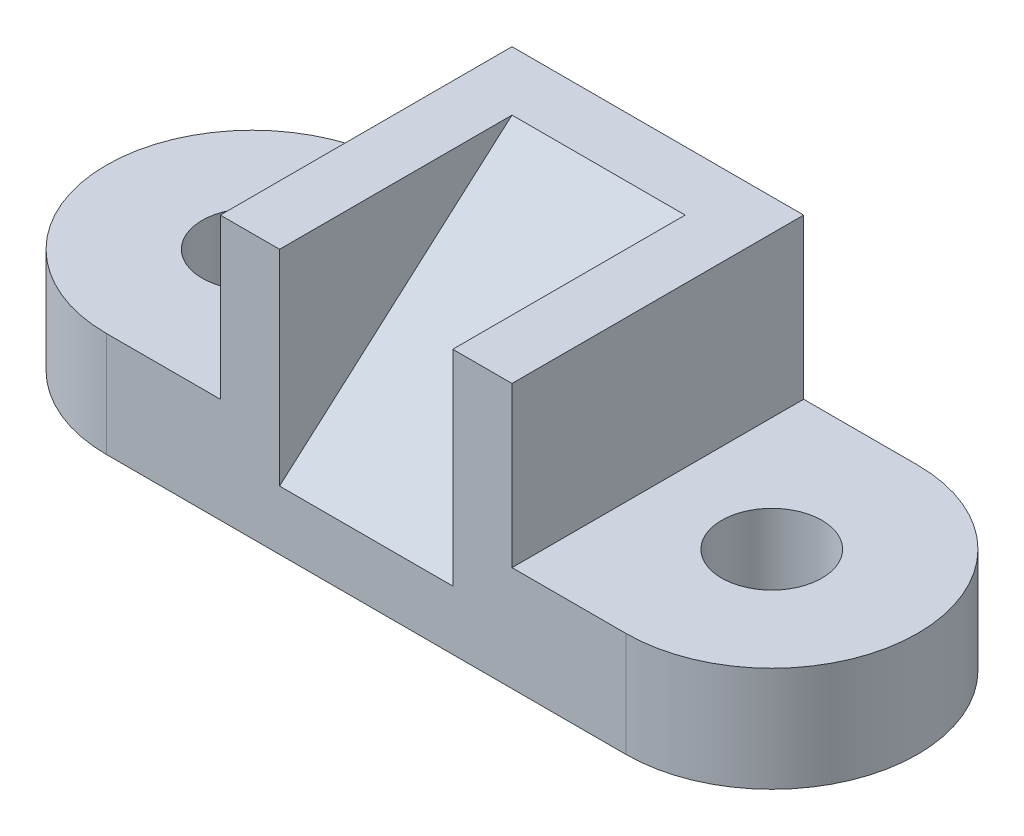
ISO-10303-21;
HEADER;
FILE_DESCRIPTION(('STEP AP214'),'2;1');
FILE_NAME('part.step','',(''),(''),'','','');
FILE_SCHEMA(('AUTOMOTIVE_DESIGN { 1 0 10303 214 1 1 1 1 }'));
ENDSEC;
DATA;
#1=APPLICATION_CONTEXT('core data for automotive mechanical design processes');
#2=APPLICATION_PROTOCOL_DEFINITION('international standard','automotive_design',2000,#1);
#3=PRODUCT_CONTEXT('',#1,'mechanical');
#4=PRODUCT('Part','Part','',(#3));
#5=PRODUCT_RELATED_PRODUCT_CATEGORY('part','',(#4));
#6=PRODUCT_DEFINITION_FORMATION('','',#4);
#7=PRODUCT_DEFINITION_CONTEXT('part definition',#1,'design');
#8=PRODUCT_DEFINITION('design','',#6,#7);
#9=PRODUCT_DEFINITION_SHAPE('','',#8);
#10=(LENGTH_UNIT() NAMED_UNIT(*) SI_UNIT(.MILLI.,.METRE.));
#11=(NAMED_UNIT(*) PLANE_ANGLE_UNIT() SI_UNIT($,.RADIAN.));
#12=(NAMED_UNIT(*) SI_UNIT($,.STERADIAN.) SOLID_ANGLE_UNIT());
#13=UNCERTAINTY_MEASURE_WITH_UNIT(LENGTH_MEASURE(1.E-05),#10,'distance_accuracy_value','');
#14=(GEOMETRIC_REPRESENTATION_CONTEXT(3) GLOBAL_UNCERTAINTY_ASSIGNED_CONTEXT((#13)) GLOBAL_UNIT_ASSIGNED_CONTEXT((#10,
#11,#12)) REPRESENTATION_CONTEXT('',''));
#15=CARTESIAN_POINT('',(0.,0.,0.));
#16=DIRECTION('',(0.,0.,1.));
#17=DIRECTION('',(1.,0.,0.));
#18=AXIS2_PLACEMENT_3D('',#15,#16,#17);
#19=CARTESIAN_POINT('',(32.,58.,0.));
#20=DIRECTION('',(1.,0.,0.));
#21=DIRECTION('',(0.,0.,-1.));
#22=AXIS2_PLACEMENT_3D('',#19,#20,#21);
#23=PLANE('',#22);
#24=DIRECTION('',(0.,-1.,0.));
#25=VECTOR('',#24,1.);
#26=CARTESIAN_POINT('',(32.,58.,32.));
#27=LINE('',#26,#25);
#28=CARTESIAN_POINT('',(32.,58.,32.));
#29=VERTEX_POINT('',#28);
#30=CARTESIAN_POINT('',(32.,23.,32.));
#31=VERTEX_POINT('',#30);
#32=EDGE_CURVE('E128',#29,#31,#27,.T.);
#33=ORIENTED_EDGE('',*,*,#32,.T.);
#34=DIRECTION('',(0.,0.,1.));
#35=VECTOR('',#34,1.);
#36=CARTESIAN_POINT('',(32.,23.,32.));
#37=LINE('',#36,#35);
#38=CARTESIAN_POINT('',(32.,23.,-32.));
#39=VERTEX_POINT('',#38);
#40=EDGE_CURVE('E134',#39,#31,#37,.T.);
#41=ORIENTED_EDGE('',*,*,#40,.F.);
#42=DIRECTION('',(0.,-1.,0.));
#43=VECTOR('',#42,1.);
#44=CARTESIAN_POINT('',(32.,58.,-32.));
#45=LINE('',#44,#43);
#46=CARTESIAN_POINT('',(32.,58.,-32.));
#47=VERTEX_POINT('',#46);
#48=EDGE_CURVE('E164',#47,#39,#45,.T.);
#49=ORIENTED_EDGE('',*,*,#48,.F.);
#50=DIRECTION('',(0.,0.,1.));
#51=VECTOR('',#50,1.);
#52=CARTESIAN_POINT('',(32.,58.,0.));
#53=LINE('',#52,#51);
#54=EDGE_CURVE('E146',#47,#29,#53,.T.);
#55=ORIENTED_EDGE('',*,*,#54,.T.);
#56=EDGE_LOOP('',(#33,#41,#49,#55));
#57=FACE_BOUND('',#56,.T.);
#58=ADVANCED_FACE('F39',(#57),#23,.T.);
#59=CARTESIAN_POINT('',(-32.,58.,0.));
#60=DIRECTION('',(-1.,0.,0.));
#61=DIRECTION('',(0.,0.,1.));
#62=AXIS2_PLACEMENT_3D('',#59,#60,#61);
#63=PLANE('',#62);
#64=DIRECTION('',(0.,-1.,0.));
#65=VECTOR('',#64,1.);
#66=CARTESIAN_POINT('',(-32.,58.,-32.));
#67=LINE('',#66,#65);
#68=CARTESIAN_POINT('',(-32.,58.,-32.));
#69=VERTEX_POINT('',#68);
#70=CARTESIAN_POINT('',(-32.,23.,-32.));
#71=VERTEX_POINT('',#70);
#72=EDGE_CURVE('E161',#69,#71,#67,.T.);
#73=ORIENTED_EDGE('',*,*,#72,.T.);
#74=DIRECTION('',(0.,0.,-1.));
#75=VECTOR('',#74,1.);
#76=CARTESIAN_POINT('',(-32.,23.,32.));
#77=LINE('',#76,#75);
#78=CARTESIAN_POINT('',(-32.,23.,32.));
#79=VERTEX_POINT('',#78);
#80=EDGE_CURVE('E213',#79,#71,#77,.T.);
#81=ORIENTED_EDGE('',*,*,#80,.F.);
#82=DIRECTION('',(0.,-1.,0.));
#83=VECTOR('',#82,1.);
#84=CARTESIAN_POINT('',(-32.,58.,32.));
#85=LINE('',#84,#83);
#86=CARTESIAN_POINT('',(-32.,58.,32.));
#87=VERTEX_POINT('',#86);
#88=EDGE_CURVE('E158',#87,#79,#85,.T.);
#89=ORIENTED_EDGE('',*,*,#88,.F.);
#90=DIRECTION('',(0.,0.,-1.));
#91=VECTOR('',#90,1.);
#92=CARTESIAN_POINT('',(-32.,58.,0.));
#93=LINE('',#92,#91);
#94=EDGE_CURVE('E225',#87,#69,#93,.T.);
#95=ORIENTED_EDGE('',*,*,#94,.T.);
#96=EDGE_LOOP('',(#73,#81,#89,#95));
#97=FACE_BOUND('',#96,.T.);
#98=ADVANCED_FACE('F249',(#97),#63,.T.);
#99=CARTESIAN_POINT('',(-57.,0.,0.));
#100=DIRECTION('',(0.,1.,0.));
#101=DIRECTION('',(0.,0.,1.));
#102=AXIS2_PLACEMENT_3D('',#99,#100,#101);
#103=PLANE('',#102);
#104=CARTESIAN_POINT('',(-57.,0.,0.));
#105=DIRECTION('',(0.,1.,0.));
#106=DIRECTION('',(0.,0.,1.));
#107=AXIS2_PLACEMENT_3D('',#104,#105,#106);
#108=CIRCLE('',#107,32.);
#109=CARTESIAN_POINT('',(-57.,0.,-32.));
#110=VERTEX_POINT('',#109);
#111=CARTESIAN_POINT('',(-57.,0.,32.));
#112=VERTEX_POINT('',#111);
#113=EDGE_CURVE('E184',#110,#112,#108,.T.);
#114=ORIENTED_EDGE('',*,*,#113,.F.);
#115=DIRECTION('',(-1.,0.,0.));
#116=VECTOR('',#115,1.);
#117=CARTESIAN_POINT('',(-57.,0.,-32.));
#118=LINE('',#117,#116);
#119=CARTESIAN_POINT('',(57.,0.,-32.));
#120=VERTEX_POINT('',#119);
#121=EDGE_CURVE('E54',#120,#110,#118,.T.);
#122=ORIENTED_EDGE('',*,*,#121,.F.);
#123=CARTESIAN_POINT('',(57.,0.,0.));
#124=DIRECTION('',(0.,1.,0.));
#125=DIRECTION('',(0.,0.,1.));
#126=AXIS2_PLACEMENT_3D('',#123,#124,#125);
#127=CIRCLE('',#126,32.);
#128=CARTESIAN_POINT('',(57.,0.,32.));
#129=VERTEX_POINT('',#128);
#130=EDGE_CURVE('E62',#129,#120,#127,.T.);
#131=ORIENTED_EDGE('',*,*,#130,.F.);
#132=DIRECTION('',(1.,0.,0.));
#133=VECTOR('',#132,1.);
#134=CARTESIAN_POINT('',(-57.,0.,32.));
#135=LINE('',#134,#133);
#136=EDGE_CURVE('E187',#112,#129,#135,.T.);
#137=ORIENTED_EDGE('',*,*,#136,.F.);
#138=EDGE_LOOP('',(#114,#122,#131,#137));
#139=FACE_BOUND('',#138,.T.);
#140=CARTESIAN_POINT('',(-57.,0.,0.));
#141=DIRECTION('',(0.,1.,0.));
#142=DIRECTION('',(0.,0.,1.));
#143=AXIS2_PLACEMENT_3D('',#140,#141,#142);
#144=CIRCLE('',#143,11.);
#145=CARTESIAN_POINT('',(-57.,0.,-11.));
#146=VERTEX_POINT('',#145);
#147=EDGE_CURVE('E181',#146,#146,#144,.T.);
#148=ORIENTED_EDGE('',*,*,#147,.T.);
#149=EDGE_LOOP('',(#148));
#150=FACE_BOUND('',#149,.T.);
#151=CARTESIAN_POINT('',(57.,0.,0.));
#152=DIRECTION('',(0.,1.,0.));
#153=DIRECTION('',(0.,0.,-1.));
#154=AXIS2_PLACEMENT_3D('',#151,#152,#153);
#155=CIRCLE('',#154,11.);
#156=CARTESIAN_POINT('',(57.,0.,-10.9999999999999));
#157=VERTEX_POINT('',#156);
#158=EDGE_CURVE('E178',#157,#157,#155,.T.);
#159=ORIENTED_EDGE('',*,*,#158,.T.);
#160=EDGE_LOOP('',(#159));
#161=FACE_BOUND('',#160,.T.);
#162=ADVANCED_FACE('F197',(#139,#150,#161),#103,.F.);
#163=CARTESIAN_POINT('',(-57.,13.,0.));
#164=DIRECTION('',(0.,-1.,0.));
#165=DIRECTION('',(0.,0.,-1.));
#166=AXIS2_PLACEMENT_3D('',#163,#164,#165);
#167=CYLINDRICAL_SURFACE('',#166,32.);
#168=ORIENTED_EDGE('',*,*,#113,.T.);
#169=DIRECTION('',(0.,-1.,0.));
#170=VECTOR('',#169,1.);
#171=CARTESIAN_POINT('',(-57.,13.,32.));
#172=LINE('',#171,#170);
#173=CARTESIAN_POINT('',(-57.,23.,32.));
#174=VERTEX_POINT('',#173);
#175=EDGE_CURVE('E11',#174,#112,#172,.T.);
#176=ORIENTED_EDGE('',*,*,#175,.F.);
#177=CARTESIAN_POINT('',(-57.,23.,0.));
#178=DIRECTION('',(0.,1.,0.));
#179=DIRECTION('',(0.,0.,-1.));
#180=AXIS2_PLACEMENT_3D('',#177,#178,#179);
#181=CIRCLE('',#180,32.);
#182=CARTESIAN_POINT('',(-57.,23.,-32.));
#183=VERTEX_POINT('',#182);
#184=EDGE_CURVE('E202',#183,#174,#181,.T.);
#185=ORIENTED_EDGE('',*,*,#184,.F.);
#186=DIRECTION('',(0.,-1.,0.));
#187=VECTOR('',#186,1.);
#188=CARTESIAN_POINT('',(-57.,13.,-32.));
#189=LINE('',#188,#187);
#190=EDGE_CURVE('E191',#183,#110,#189,.T.);
#191=ORIENTED_EDGE('',*,*,#190,.T.);
#192=EDGE_LOOP('',(#168,#176,#185,#191));
#193=FACE_BOUND('',#192,.T.);
#194=ADVANCED_FACE('F41',(#193),#167,.T.);
#195=CARTESIAN_POINT('',(-57.,13.,32.));
#196=DIRECTION('',(0.,0.,-1.));
#197=DIRECTION('',(-1.,0.,0.));
#198=AXIS2_PLACEMENT_3D('',#195,#196,#197);
#199=PLANE('',#198);
#200=DIRECTION('',(0.,-1.,0.));
#201=VECTOR('',#200,1.);
#202=CARTESIAN_POINT('',(57.,13.,32.));
#203=LINE('',#202,#201);
#204=CARTESIAN_POINT('',(57.,23.,32.));
#205=VERTEX_POINT('',#204);
#206=EDGE_CURVE('E47',#205,#129,#203,.T.);
#207=ORIENTED_EDGE('',*,*,#206,.F.);
#208=DIRECTION('',(1.,0.,0.));
#209=VECTOR('',#208,1.);
#210=CARTESIAN_POINT('',(32.,23.,32.));
#211=LINE('',#210,#209);
#212=EDGE_CURVE('E123',#31,#205,#211,.T.);
#213=ORIENTED_EDGE('',*,*,#212,.F.);
#214=ORIENTED_EDGE('',*,*,#32,.F.);
#215=DIRECTION('',(1.,0.,0.));
#216=VECTOR('',#215,1.);
#217=CARTESIAN_POINT('',(0.,58.,32.));
#218=LINE('',#217,#216);
#219=CARTESIAN_POINT('',(19.,58.,32.));
#220=VERTEX_POINT('',#219);
#221=EDGE_CURVE('E148',#220,#29,#218,.T.);
#222=ORIENTED_EDGE('',*,*,#221,.F.);
#223=DIRECTION('',(0.,-1.,0.));
#224=VECTOR('',#223,1.);
#225=CARTESIAN_POINT('',(19.,58.,32.));
#226=LINE('',#225,#224);
#227=CARTESIAN_POINT('',(19.,13.,32.));
#228=VERTEX_POINT('',#227);
#229=EDGE_CURVE('E147',#220,#228,#226,.T.);
#230=ORIENTED_EDGE('',*,*,#229,.T.);
#231=DIRECTION('',(1.,0.,0.));
#232=VECTOR('',#231,1.);
#233=CARTESIAN_POINT('',(-26.,13.,32.));
#234=LINE('',#233,#232);
#235=CARTESIAN_POINT('',(-19.,13.,32.));
#236=VERTEX_POINT('',#235);
#237=EDGE_CURVE('E169',#236,#228,#234,.T.);
#238=ORIENTED_EDGE('',*,*,#237,.F.);
#239=DIRECTION('',(0.,-1.,0.));
#240=VECTOR('',#239,1.);
#241=CARTESIAN_POINT('',(-19.,58.,32.));
#242=LINE('',#241,#240);
#243=CARTESIAN_POINT('',(-19.,58.,32.));
#244=VERTEX_POINT('',#243);
#245=EDGE_CURVE('E151',#244,#236,#242,.T.);
#246=ORIENTED_EDGE('',*,*,#245,.F.);
#247=DIRECTION('',(1.,0.,0.));
#248=VECTOR('',#247,1.);
#249=CARTESIAN_POINT('',(0.,58.,32.));
#250=LINE('',#249,#248);
#251=EDGE_CURVE('E228',#87,#244,#250,.T.);
#252=ORIENTED_EDGE('',*,*,#251,.F.);
#253=ORIENTED_EDGE('',*,*,#88,.T.);
#254=DIRECTION('',(1.,0.,0.));
#255=VECTOR('',#254,1.);
#256=CARTESIAN_POINT('',(-32.,23.,32.));
#257=LINE('',#256,#255);
#258=EDGE_CURVE('E215',#174,#79,#257,.T.);
#259=ORIENTED_EDGE('',*,*,#258,.F.);
#260=ORIENTED_EDGE('',*,*,#175,.T.);
#261=ORIENTED_EDGE('',*,*,#136,.T.);
#262=EDGE_LOOP('',(#207,#213,#214,#222,#230,#238,#246,#252,#253,#259,#260,#261));
#263=FACE_BOUND('',#262,.T.);
#264=ADVANCED_FACE('F125',(#263),#199,.F.);
#265=CARTESIAN_POINT('',(57.,13.,0.));
#266=DIRECTION('',(0.,-1.,0.));
#267=DIRECTION('',(0.,0.,-1.));
#268=AXIS2_PLACEMENT_3D('',#265,#266,#267);
#269=CYLINDRICAL_SURFACE('',#268,32.);
#270=ORIENTED_EDGE('',*,*,#130,.T.);
#271=DIRECTION('',(0.,-1.,0.));
#272=VECTOR('',#271,1.);
#273=CARTESIAN_POINT('',(57.,13.,-32.));
#274=LINE('',#273,#272);
#275=CARTESIAN_POINT('',(57.,23.,-32.));
#276=VERTEX_POINT('',#275);
#277=EDGE_CURVE('E193',#276,#120,#274,.T.);
#278=ORIENTED_EDGE('',*,*,#277,.F.);
#279=CARTESIAN_POINT('',(57.,23.,0.));
#280=DIRECTION('',(0.,1.,0.));
#281=DIRECTION('',(0.,0.,-1.));
#282=AXIS2_PLACEMENT_3D('',#279,#280,#281);
#283=CIRCLE('',#282,32.);
#284=EDGE_CURVE('E133',#205,#276,#283,.T.);
#285=ORIENTED_EDGE('',*,*,#284,.F.);
#286=ORIENTED_EDGE('',*,*,#206,.T.);
#287=EDGE_LOOP('',(#270,#278,#285,#286));
#288=FACE_BOUND('',#287,.T.);
#289=ADVANCED_FACE('F194',(#288),#269,.T.);
#290=CARTESIAN_POINT('',(-57.,13.,-32.));
#291=DIRECTION('',(0.,0.,1.));
#292=DIRECTION('',(1.,0.,0.));
#293=AXIS2_PLACEMENT_3D('',#290,#291,#292);
#294=PLANE('',#293);
#295=ORIENTED_EDGE('',*,*,#190,.F.);
#296=DIRECTION('',(-1.,0.,0.));
#297=VECTOR('',#296,1.);
#298=CARTESIAN_POINT('',(-32.,23.,-32.));
#299=LINE('',#298,#297);
#300=EDGE_CURVE('E206',#71,#183,#299,.T.);
#301=ORIENTED_EDGE('',*,*,#300,.F.);
#302=ORIENTED_EDGE('',*,*,#72,.F.);
#303=DIRECTION('',(-1.,0.,0.));
#304=VECTOR('',#303,1.);
#305=CARTESIAN_POINT('',(0.,58.,-32.));
#306=LINE('',#305,#304);
#307=EDGE_CURVE('E223',#47,#69,#306,.T.);
#308=ORIENTED_EDGE('',*,*,#307,.F.);
#309=ORIENTED_EDGE('',*,*,#48,.T.);
#310=DIRECTION('',(-1.,0.,0.));
#311=VECTOR('',#310,1.);
#312=CARTESIAN_POINT('',(32.,23.,-32.));
#313=LINE('',#312,#311);
#314=EDGE_CURVE('E140',#276,#39,#313,.T.);
#315=ORIENTED_EDGE('',*,*,#314,.F.);
#316=ORIENTED_EDGE('',*,*,#277,.T.);
#317=ORIENTED_EDGE('',*,*,#121,.T.);
#318=EDGE_LOOP('',(#295,#301,#302,#308,#309,#315,#316,#317));
#319=FACE_BOUND('',#318,.T.);
#320=ADVANCED_FACE('F204',(#319),#294,.F.);
#321=CARTESIAN_POINT('',(-57.,13.,0.));
#322=DIRECTION('',(0.,-1.,0.));
#323=DIRECTION('',(0.,0.,-1.));
#324=AXIS2_PLACEMENT_3D('',#321,#322,#323);
#325=CYLINDRICAL_SURFACE('',#324,11.);
#326=CARTESIAN_POINT('',(-57.,23.,0.));
#327=DIRECTION('',(0.,1.,0.));
#328=DIRECTION('',(0.,0.,1.));
#329=AXIS2_PLACEMENT_3D('',#326,#327,#328);
#330=CIRCLE('',#329,11.);
#331=CARTESIAN_POINT('',(-57.,23.,-11.));
#332=VERTEX_POINT('',#331);
#333=EDGE_CURVE('E217',#332,#332,#330,.T.);
#334=CARTESIAN_POINT('',(-57.,0.,-11.));
#335=CARTESIAN_POINT('',(-57.,0.239583333333334,-11.));
#336=CARTESIAN_POINT('',(-57.,0.479166666666667,-11.));
#337=CARTESIAN_POINT('',(-57.,0.958333333333334,-11.));
#338=CARTESIAN_POINT('',(-57.,1.19791666666667,-11.));
#339=CARTESIAN_POINT('',(-57.,1.67708333333333,-11.));
#340=CARTESIAN_POINT('',(-57.,1.91666666666667,-11.));
#341=CARTESIAN_POINT('',(-57.,2.39583333333333,-11.));
#342=CARTESIAN_POINT('',(-57.,2.63541666666667,-11.));
#343=CARTESIAN_POINT('',(-57.,3.11458333333333,-11.));
#344=CARTESIAN_POINT('',(-57.,3.35416666666667,-11.));
#345=CARTESIAN_POINT('',(-57.,3.83333333333333,-11.));
#346=CARTESIAN_POINT('',(-57.,4.07291666666667,-11.));
#347=CARTESIAN_POINT('',(-57.,4.55208333333333,-11.));
#348=CARTESIAN_POINT('',(-57.,4.79166666666667,-11.));
#349=CARTESIAN_POINT('',(-57.,5.27083333333333,-11.));
#350=CARTESIAN_POINT('',(-57.,5.51041666666667,-11.));
#351=CARTESIAN_POINT('',(-57.,5.98958333333333,-11.));
#352=CARTESIAN_POINT('',(-57.,6.22916666666667,-11.));
#353=CARTESIAN_POINT('',(-57.,6.70833333333333,-11.));
#354=CARTESIAN_POINT('',(-57.,6.94791666666667,-11.));
#355=CARTESIAN_POINT('',(-57.,7.42708333333333,-11.));
#356=CARTESIAN_POINT('',(-57.,7.66666666666667,-11.));
#357=CARTESIAN_POINT('',(-57.,8.14583333333333,-11.));
#358=CARTESIAN_POINT('',(-57.,8.38541666666667,-11.));
#359=CARTESIAN_POINT('',(-57.,8.86458333333333,-11.));
#360=CARTESIAN_POINT('',(-57.,9.10416666666666,-11.));
#361=CARTESIAN_POINT('',(-57.,9.58333333333333,-11.));
#362=CARTESIAN_POINT('',(-57.,9.82291666666667,-11.));
#363=CARTESIAN_POINT('',(-57.,10.3020833333333,-11.));
#364=CARTESIAN_POINT('',(-57.,10.5416666666667,-11.));
#365=CARTESIAN_POINT('',(-57.,11.0208333333333,-11.));
#366=CARTESIAN_POINT('',(-57.,11.2604166666667,-11.));
#367=CARTESIAN_POINT('',(-57.,11.7395833333333,-11.));
#368=CARTESIAN_POINT('',(-57.,11.9791666666667,-11.));
#369=CARTESIAN_POINT('',(-57.,12.4583333333333,-11.));
#370=CARTESIAN_POINT('',(-57.,12.6979166666667,-11.));
#371=CARTESIAN_POINT('',(-57.,13.1770833333333,-11.));
#372=CARTESIAN_POINT('',(-57.,13.4166666666667,-11.));
#373=CARTESIAN_POINT('',(-57.,13.8958333333333,-11.));
#374=CARTESIAN_POINT('',(-57.,14.1354166666667,-11.));
#375=CARTESIAN_POINT('',(-57.,14.6145833333333,-11.));
#376=CARTESIAN_POINT('',(-57.,14.8541666666667,-11.));
#377=CARTESIAN_POINT('',(-57.,15.3333333333333,-11.));
#378=CARTESIAN_POINT('',(-57.,15.5729166666667,-11.));
#379=CARTESIAN_POINT('',(-57.,16.0520833333333,-11.));
#380=CARTESIAN_POINT('',(-57.,16.2916666666667,-11.));
#381=CARTESIAN_POINT('',(-57.,16.7708333333333,-11.));
#382=CARTESIAN_POINT('',(-57.,17.0104166666667,-11.));
#383=CARTESIAN_POINT('',(-57.,17.4895833333333,-11.));
#384=CARTESIAN_POINT('',(-57.,17.7291666666667,-11.));
#385=CARTESIAN_POINT('',(-57.,18.2083333333333,-11.));
#386=CARTESIAN_POINT('',(-57.,18.4479166666667,-11.));
#387=CARTESIAN_POINT('',(-57.,18.9270833333333,-11.));
#388=CARTESIAN_POINT('',(-57.,19.1666666666667,-11.));
#389=CARTESIAN_POINT('',(-57.,19.6458333333333,-11.));
#390=CARTESIAN_POINT('',(-57.,19.8854166666667,-11.));
#391=CARTESIAN_POINT('',(-57.,20.3645833333333,-11.));
#392=CARTESIAN_POINT('',(-57.,20.6041666666667,-11.));
#393=CARTESIAN_POINT('',(-57.,21.0833333333333,-11.));
#394=CARTESIAN_POINT('',(-57.,21.3229166666667,-11.));
#395=CARTESIAN_POINT('',(-57.,21.8020833333333,-11.));
#396=CARTESIAN_POINT('',(-57.,22.0416666666667,-11.));
#397=CARTESIAN_POINT('',(-57.,22.5208333333333,-11.));
#398=CARTESIAN_POINT('',(-57.,22.7604166666667,-11.));
#399=CARTESIAN_POINT('',(-57.,23.,-11.));
#400=B_SPLINE_CURVE_WITH_KNOTS('',3,(#334,#335,#336,#337,#338,#339,#340,#341,#342,#343,#344,
#345,#346,#347,#348,#349,#350,#351,#352,#353,#354,#355,#356,#357,#358,#359,#360,#361,#362,#363,
#364,#365,#366,#367,#368,#369,#370,#371,#372,#373,#374,#375,#376,#377,#378,#379,#380,#381,#382,
#383,#384,#385,#386,#387,#388,#389,#390,#391,#392,#393,#394,#395,#396,#397,#398,#399),
.UNSPECIFIED.,.F.,.F.,(4,2,2,2,2,2,2,2,2,2,2,2,2,2,2,2,2,2,2,2,2,2,2,2,2,2,2,2,2,2,2,2,4),(0.,
0.718750000000001,1.4375,2.15625,2.875,3.59375,4.3125,5.03125,5.75,6.46875,7.1875,7.90625,8.625,
9.34375,10.0625,10.78125,11.5,12.21875,12.9375,13.65625,14.375,15.09375,15.8125,16.53125,17.25,
17.96875,18.6875,19.40625,20.125,20.84375,21.5625,22.28125,23.),.UNSPECIFIED.);
#401=EDGE_CURVE('BSEAM276',#146,#332,#400,.T.);
#402=ORIENTED_EDGE('',*,*,#147,.F.);
#403=ORIENTED_EDGE('',*,*,#333,.T.);
#404=ORIENTED_EDGE('',*,*,#401,.T.);
#405=ORIENTED_EDGE('',*,*,#401,.F.);
#406=EDGE_LOOP('',(#402,#404,#403,#405));
#407=FACE_BOUND('',#406,.T.);
#408=ADVANCED_FACE('F276',(#407),#325,.F.);
#409=CARTESIAN_POINT('',(57.,13.,0.));
#410=DIRECTION('',(0.,-1.,0.));
#411=DIRECTION('',(0.,0.,-1.));
#412=AXIS2_PLACEMENT_3D('',#409,#410,#411);
#413=CYLINDRICAL_SURFACE('',#412,11.);
#414=CARTESIAN_POINT('',(57.,23.,0.));
#415=DIRECTION('',(0.,1.,0.));
#416=DIRECTION('',(0.,0.,1.));
#417=AXIS2_PLACEMENT_3D('',#414,#415,#416);
#418=CIRCLE('',#417,11.);
#419=CARTESIAN_POINT('',(57.,23.,-10.9999999999999));
#420=VERTEX_POINT('',#419);
#421=EDGE_CURVE('E143',#420,#420,#418,.T.);
#422=CARTESIAN_POINT('',(57.,0.,-10.9999999999999));
#423=CARTESIAN_POINT('',(57.,0.239583333333334,-10.9999999999999));
#424=CARTESIAN_POINT('',(57.,0.479166666666667,-10.9999999999999));
#425=CARTESIAN_POINT('',(57.,0.958333333333334,-10.9999999999999));
#426=CARTESIAN_POINT('',(57.,1.19791666666667,-10.9999999999999));
#427=CARTESIAN_POINT('',(57.,1.67708333333333,-10.9999999999999));
#428=CARTESIAN_POINT('',(57.,1.91666666666667,-10.9999999999999));
#429=CARTESIAN_POINT('',(57.,2.39583333333333,-10.9999999999999));
#430=CARTESIAN_POINT('',(57.,2.63541666666667,-10.9999999999999));
#431=CARTESIAN_POINT('',(57.,3.11458333333333,-10.9999999999999));
#432=CARTESIAN_POINT('',(57.,3.35416666666667,-10.9999999999999));
#433=CARTESIAN_POINT('',(57.,3.83333333333333,-10.9999999999999));
#434=CARTESIAN_POINT('',(57.,4.07291666666667,-10.9999999999999));
#435=CARTESIAN_POINT('',(57.,4.55208333333333,-10.9999999999999));
#436=CARTESIAN_POINT('',(57.,4.79166666666667,-10.9999999999999));
#437=CARTESIAN_POINT('',(57.,5.27083333333333,-10.9999999999999));
#438=CARTESIAN_POINT('',(57.,5.51041666666667,-10.9999999999999));
#439=CARTESIAN_POINT('',(57.,5.98958333333333,-10.9999999999999));
#440=CARTESIAN_POINT('',(57.,6.22916666666667,-10.9999999999999));
#441=CARTESIAN_POINT('',(57.,6.70833333333333,-10.9999999999999));
#442=CARTESIAN_POINT('',(57.,6.94791666666667,-10.9999999999999));
#443=CARTESIAN_POINT('',(57.,7.42708333333333,-10.9999999999999));
#444=CARTESIAN_POINT('',(57.,7.66666666666667,-10.9999999999999));
#445=CARTESIAN_POINT('',(57.,8.14583333333333,-10.9999999999999));
#446=CARTESIAN_POINT('',(57.,8.38541666666667,-10.9999999999999));
#447=CARTESIAN_POINT('',(57.,8.86458333333333,-10.9999999999999));
#448=CARTESIAN_POINT('',(57.,9.10416666666666,-10.9999999999999));
#449=CARTESIAN_POINT('',(57.,9.58333333333333,-10.9999999999999));
#450=CARTESIAN_POINT('',(57.,9.82291666666667,-10.9999999999999));
#451=CARTESIAN_POINT('',(57.,10.3020833333333,-10.9999999999999));
#452=CARTESIAN_POINT('',(57.,10.5416666666667,-10.9999999999999));
#453=CARTESIAN_POINT('',(57.,11.0208333333333,-10.9999999999999));
#454=CARTESIAN_POINT('',(57.,11.2604166666667,-10.9999999999999));
#455=CARTESIAN_POINT('',(57.,11.7395833333333,-10.9999999999999));
#456=CARTESIAN_POINT('',(57.,11.9791666666667,-10.9999999999999));
#457=CARTESIAN_POINT('',(57.,12.4583333333333,-10.9999999999999));
#458=CARTESIAN_POINT('',(57.,12.6979166666667,-10.9999999999999));
#459=CARTESIAN_POINT('',(57.,13.1770833333333,-10.9999999999999));
#460=CARTESIAN_POINT('',(57.,13.4166666666667,-10.9999999999999));
#461=CARTESIAN_POINT('',(57.,13.8958333333333,-10.9999999999999));
#462=CARTESIAN_POINT('',(57.,14.1354166666667,-10.9999999999999));
#463=CARTESIAN_POINT('',(57.,14.6145833333333,-10.9999999999999));
#464=CARTESIAN_POINT('',(57.,14.8541666666667,-10.9999999999999));
#465=CARTESIAN_POINT('',(57.,15.3333333333333,-10.9999999999999));
#466=CARTESIAN_POINT('',(57.,15.5729166666667,-10.9999999999999));
#467=CARTESIAN_POINT('',(57.,16.0520833333333,-10.9999999999999));
#468=CARTESIAN_POINT('',(57.,16.2916666666667,-10.9999999999999));
#469=CARTESIAN_POINT('',(57.,16.7708333333333,-10.9999999999999));
#470=CARTESIAN_POINT('',(57.,17.0104166666667,-10.9999999999999));
#471=CARTESIAN_POINT('',(57.,17.4895833333333,-10.9999999999999));
#472=CARTESIAN_POINT('',(57.,17.7291666666667,-10.9999999999999));
#473=CARTESIAN_POINT('',(57.,18.2083333333333,-10.9999999999999));
#474=CARTESIAN_POINT('',(57.,18.4479166666667,-10.9999999999999));
#475=CARTESIAN_POINT('',(57.,18.9270833333333,-10.9999999999999));
#476=CARTESIAN_POINT('',(57.,19.1666666666667,-10.9999999999999));
#477=CARTESIAN_POINT('',(57.,19.6458333333333,-10.9999999999999));
#478=CARTESIAN_POINT('',(57.,19.8854166666667,-10.9999999999999));
#479=CARTESIAN_POINT('',(57.,20.3645833333333,-10.9999999999999));
#480=CARTESIAN_POINT('',(57.,20.6041666666667,-10.9999999999999));
#481=CARTESIAN_POINT('',(57.,21.0833333333333,-10.9999999999999));
#482=CARTESIAN_POINT('',(57.,21.3229166666667,-10.9999999999999));
#483=CARTESIAN_POINT('',(57.,21.8020833333333,-10.9999999999999));
#484=CARTESIAN_POINT('',(57.,22.0416666666667,-10.9999999999999));
#485=CARTESIAN_POINT('',(57.,22.5208333333333,-10.9999999999999));
#486=CARTESIAN_POINT('',(57.,22.7604166666667,-10.9999999999999));
#487=CARTESIAN_POINT('',(57.,23.,-10.9999999999999));
#488=B_SPLINE_CURVE_WITH_KNOTS('',3,(#422,#423,#424,#425,#426,#427,#428,#429,#430,#431,#432,
#433,#434,#435,#436,#437,#438,#439,#440,#441,#442,#443,#444,#445,#446,#447,#448,#449,#450,#451,
#452,#453,#454,#455,#456,#457,#458,#459,#460,#461,#462,#463,#464,#465,#466,#467,#468,#469,#470,
#471,#472,#473,#474,#475,#476,#477,#478,#479,#480,#481,#482,#483,#484,#485,#486,#487),
.UNSPECIFIED.,.F.,.F.,(4,2,2,2,2,2,2,2,2,2,2,2,2,2,2,2,2,2,2,2,2,2,2,2,2,2,2,2,2,2,2,2,4),(0.,
0.718750000000001,1.4375,2.15625,2.875,3.59375,4.3125,5.03125,5.75,6.46875,7.1875,7.90625,8.625,
9.34375,10.0625,10.78125,11.5,12.21875,12.9375,13.65625,14.375,15.09375,15.8125,16.53125,17.25,
17.96875,18.6875,19.40625,20.125,20.84375,21.5625,22.28125,23.),.UNSPECIFIED.);
#489=EDGE_CURVE('BSEAM257',#157,#420,#488,.T.);
#490=ORIENTED_EDGE('',*,*,#158,.F.);
#491=ORIENTED_EDGE('',*,*,#421,.T.);
#492=ORIENTED_EDGE('',*,*,#489,.T.);
#493=ORIENTED_EDGE('',*,*,#489,.F.);
#494=EDGE_LOOP('',(#490,#492,#491,#493));
#495=FACE_BOUND('',#494,.T.);
#496=ADVANCED_FACE('F257',(#495),#413,.F.);
#497=CARTESIAN_POINT('',(-26.,58.,-19.));
#498=DIRECTION('',(0.,-0.749837855365093,-0.661621637086846));
#499=DIRECTION('',(0.,0.661621637086846,-0.749837855365093));
#500=AXIS2_PLACEMENT_3D('',#497,#498,#499);
#501=PLANE('',#500);
#502=ORIENTED_EDGE('',*,*,#237,.T.);
#503=DIRECTION('',(0.,0.661621637086846,-0.749837855365093));
#504=VECTOR('',#503,1.);
#505=CARTESIAN_POINT('',(19.,58.,-19.));
#506=LINE('',#505,#504);
#507=CARTESIAN_POINT('',(19.,58.,-19.));
#508=VERTEX_POINT('',#507);
#509=EDGE_CURVE('E166',#228,#508,#506,.T.);
#510=ORIENTED_EDGE('',*,*,#509,.T.);
#511=DIRECTION('',(-1.,0.,0.));
#512=VECTOR('',#511,1.);
#513=CARTESIAN_POINT('',(-19.,58.,-19.));
#514=LINE('',#513,#512);
#515=CARTESIAN_POINT('',(-19.,58.,-19.));
#516=VERTEX_POINT('',#515);
#517=EDGE_CURVE('E175',#508,#516,#514,.T.);
#518=ORIENTED_EDGE('',*,*,#517,.T.);
#519=DIRECTION('',(0.,0.661621637086846,-0.749837855365093));
#520=VECTOR('',#519,1.);
#521=CARTESIAN_POINT('',(-19.,32.6984435797665,9.67509727626461));
#522=LINE('',#521,#520);
#523=EDGE_CURVE('E172',#236,#516,#522,.T.);
#524=ORIENTED_EDGE('',*,*,#523,.F.);
#525=EDGE_LOOP('',(#502,#510,#518,#524));
#526=FACE_BOUND('',#525,.T.);
#527=ADVANCED_FACE('F241',(#526),#501,.F.);
#528=CARTESIAN_POINT('',(-19.,58.,0.));
#529=DIRECTION('',(-1.,0.,0.));
#530=DIRECTION('',(0.,0.,1.));
#531=AXIS2_PLACEMENT_3D('',#528,#529,#530);
#532=PLANE('',#531);
#533=ORIENTED_EDGE('',*,*,#245,.T.);
#534=ORIENTED_EDGE('',*,*,#523,.T.);
#535=DIRECTION('',(0.,0.,-1.));
#536=VECTOR('',#535,1.);
#537=CARTESIAN_POINT('',(-19.,58.,0.));
#538=LINE('',#537,#536);
#539=EDGE_CURVE('E230',#244,#516,#538,.T.);
#540=ORIENTED_EDGE('',*,*,#539,.F.);
#541=EDGE_LOOP('',(#533,#534,#540));
#542=FACE_BOUND('',#541,.T.);
#543=ADVANCED_FACE('F244',(#542),#532,.F.);
#544=CARTESIAN_POINT('',(19.,58.,0.));
#545=DIRECTION('',(1.,0.,0.));
#546=DIRECTION('',(0.,0.,-1.));
#547=AXIS2_PLACEMENT_3D('',#544,#545,#546);
#548=PLANE('',#547);
#549=DIRECTION('',(0.,0.,1.));
#550=VECTOR('',#549,1.);
#551=CARTESIAN_POINT('',(19.,58.,0.));
#552=LINE('',#551,#550);
#553=EDGE_CURVE('E153',#508,#220,#552,.T.);
#554=ORIENTED_EDGE('',*,*,#553,.F.);
#555=ORIENTED_EDGE('',*,*,#509,.F.);
#556=ORIENTED_EDGE('',*,*,#229,.F.);
#557=EDGE_LOOP('',(#554,#555,#556));
#558=FACE_BOUND('',#557,.T.);
#559=ADVANCED_FACE('F236',(#558),#548,.F.);
#560=CARTESIAN_POINT('',(0.,58.,0.));
#561=DIRECTION('',(0.,1.,0.));
#562=DIRECTION('',(0.,0.,1.));
#563=AXIS2_PLACEMENT_3D('',#560,#561,#562);
#564=PLANE('',#563);
#565=ORIENTED_EDGE('',*,*,#54,.F.);
#566=ORIENTED_EDGE('',*,*,#307,.T.);
#567=ORIENTED_EDGE('',*,*,#94,.F.);
#568=ORIENTED_EDGE('',*,*,#251,.T.);
#569=ORIENTED_EDGE('',*,*,#539,.T.);
#570=ORIENTED_EDGE('',*,*,#517,.F.);
#571=ORIENTED_EDGE('',*,*,#553,.T.);
#572=ORIENTED_EDGE('',*,*,#221,.T.);
#573=EDGE_LOOP('',(#565,#566,#567,#568,#569,#570,#571,#572));
#574=FACE_BOUND('',#573,.T.);
#575=ADVANCED_FACE('F234',(#574),#564,.T.);
#576=CARTESIAN_POINT('',(-57.,23.,0.));
#577=DIRECTION('',(0.,-1.,0.));
#578=DIRECTION('',(0.,0.,-1.));
#579=AXIS2_PLACEMENT_3D('',#576,#577,#578);
#580=PLANE('',#579);
#581=ORIENTED_EDGE('',*,*,#80,.T.);
#582=ORIENTED_EDGE('',*,*,#300,.T.);
#583=ORIENTED_EDGE('',*,*,#184,.T.);
#584=ORIENTED_EDGE('',*,*,#258,.T.);
#585=EDGE_LOOP('',(#581,#582,#583,#584));
#586=FACE_BOUND('',#585,.T.);
#587=ORIENTED_EDGE('',*,*,#333,.F.);
#588=EDGE_LOOP('',(#587));
#589=FACE_BOUND('',#588,.T.);
#590=ADVANCED_FACE('F209',(#586,#589),#580,.F.);
#591=CARTESIAN_POINT('',(57.,23.,0.));
#592=DIRECTION('',(0.,-1.,0.));
#593=DIRECTION('',(0.,0.,-1.));
#594=AXIS2_PLACEMENT_3D('',#591,#592,#593);
#595=PLANE('',#594);
#596=ORIENTED_EDGE('',*,*,#40,.T.);
#597=ORIENTED_EDGE('',*,*,#212,.T.);
#598=ORIENTED_EDGE('',*,*,#284,.T.);
#599=ORIENTED_EDGE('',*,*,#314,.T.);
#600=EDGE_LOOP('',(#596,#597,#598,#599));
#601=FACE_BOUND('',#600,.T.);
#602=ORIENTED_EDGE('',*,*,#421,.F.);
#603=EDGE_LOOP('',(#602));
#604=FACE_BOUND('',#603,.T.);
#605=ADVANCED_FACE('F137',(#601,#604),#595,.F.);
#606=CLOSED_SHELL('',(#58,#98,#162,#194,#264,#289,#320,#408,#496,#527,#543,#559,#575,#590,#605));
#607=MANIFOLD_SOLID_BREP('B2',#606);
#608=ADVANCED_BREP_SHAPE_REPRESENTATION('',(#18,#607),#14);
#609=SHAPE_DEFINITION_REPRESENTATION(#9,#608);
ENDSEC;
END-ISO-10303-21;
